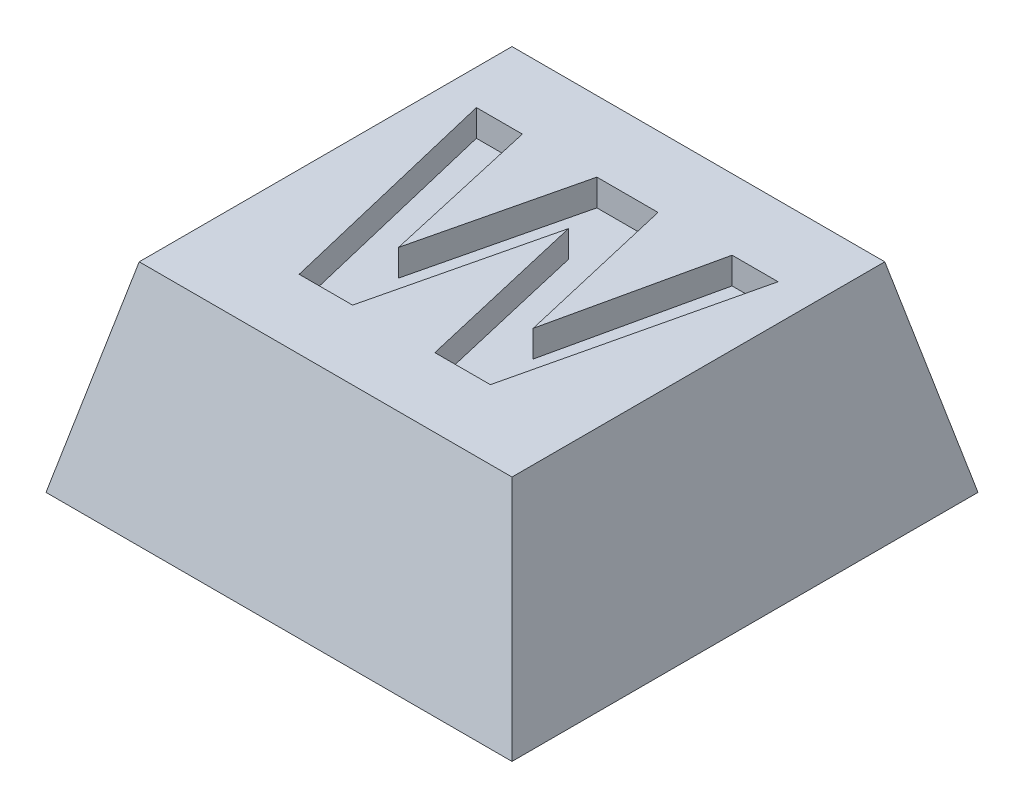
ISO-10303-21;
HEADER;
FILE_DESCRIPTION(('STEP AP214'),'2;1');
FILE_NAME('part.step','',(''),(''),'','','');
FILE_SCHEMA(('AUTOMOTIVE_DESIGN { 1 0 10303 214 1 1 1 1 }'));
ENDSEC;
DATA;
#1=APPLICATION_CONTEXT('core data for automotive mechanical design processes');
#2=APPLICATION_PROTOCOL_DEFINITION('international standard','automotive_design',2000,#1);
#3=PRODUCT_CONTEXT('',#1,'mechanical');
#4=PRODUCT('Part','Part','',(#3));
#5=PRODUCT_RELATED_PRODUCT_CATEGORY('part','',(#4));
#6=PRODUCT_DEFINITION_FORMATION('','',#4);
#7=PRODUCT_DEFINITION_CONTEXT('part definition',#1,'design');
#8=PRODUCT_DEFINITION('design','',#6,#7);
#9=PRODUCT_DEFINITION_SHAPE('','',#8);
#10=(LENGTH_UNIT() NAMED_UNIT(*) SI_UNIT(.MILLI.,.METRE.));
#11=(NAMED_UNIT(*) PLANE_ANGLE_UNIT() SI_UNIT($,.RADIAN.));
#12=(NAMED_UNIT(*) SI_UNIT($,.STERADIAN.) SOLID_ANGLE_UNIT());
#13=UNCERTAINTY_MEASURE_WITH_UNIT(LENGTH_MEASURE(1.E-05),#10,'distance_accuracy_value','');
#14=(GEOMETRIC_REPRESENTATION_CONTEXT(3) GLOBAL_UNCERTAINTY_ASSIGNED_CONTEXT((#13)) GLOBAL_UNIT_ASSIGNED_CONTEXT((#10,
#11,#12)) REPRESENTATION_CONTEXT('',''));
#15=CARTESIAN_POINT('',(0.,0.,0.));
#16=DIRECTION('',(0.,0.,1.));
#17=DIRECTION('',(1.,0.,0.));
#18=AXIS2_PLACEMENT_3D('',#15,#16,#17);
#19=CARTESIAN_POINT('',(0.,3.,0.));
#20=DIRECTION('',(0.,-1.,0.));
#21=DIRECTION('',(0.,0.,-1.));
#22=AXIS2_PLACEMENT_3D('',#19,#20,#21);
#23=PLANE('',#22);
#24=DIRECTION('',(-1.,0.,0.));
#25=VECTOR('',#24,1.);
#26=CARTESIAN_POINT('',(11.,3.,-0.7));
#27=LINE('',#26,#25);
#28=CARTESIAN_POINT('',(6.3,3.,-0.7));
#29=VERTEX_POINT('',#28);
#30=CARTESIAN_POINT('',(0.7,3.,-0.7));
#31=VERTEX_POINT('',#30);
#32=EDGE_CURVE('E66',#29,#31,#27,.T.);
#33=ORIENTED_EDGE('',*,*,#32,.F.);
#34=DIRECTION('',(0.,0.,1.));
#35=VECTOR('',#34,1.);
#36=CARTESIAN_POINT('',(6.3,3.,-7.));
#37=LINE('',#36,#35);
#38=CARTESIAN_POINT('',(6.3,3.,-6.3));
#39=VERTEX_POINT('',#38);
#40=EDGE_CURVE('E213',#39,#29,#37,.T.);
#41=ORIENTED_EDGE('',*,*,#40,.F.);
#42=DIRECTION('',(-1.,0.,0.));
#43=VECTOR('',#42,1.);
#44=CARTESIAN_POINT('',(11.,3.,-6.3));
#45=LINE('',#44,#43);
#46=CARTESIAN_POINT('',(0.699999999999998,3.,-6.3));
#47=VERTEX_POINT('',#46);
#48=EDGE_CURVE('E200',#39,#47,#45,.T.);
#49=ORIENTED_EDGE('',*,*,#48,.T.);
#50=DIRECTION('',(0.,0.,1.));
#51=VECTOR('',#50,1.);
#52=CARTESIAN_POINT('',(0.7,3.,-7.));
#53=LINE('',#52,#51);
#54=EDGE_CURVE('E214',#47,#31,#53,.T.);
#55=ORIENTED_EDGE('',*,*,#54,.T.);
#56=EDGE_LOOP('',(#33,#41,#49,#55));
#57=FACE_BOUND('',#56,.T.);
#58=DIRECTION('',(-1.,0.,0.));
#59=VECTOR('',#58,1.);
#60=CARTESIAN_POINT('',(2.86619578702468,3.,-1.73904144867035));
#61=LINE('',#60,#59);
#62=CARTESIAN_POINT('',(2.86619578702468,3.,-1.73904144867035));
#63=VERTEX_POINT('',#62);
#64=CARTESIAN_POINT('',(2.06411245369135,3.,-1.73904144867035));
#65=VERTEX_POINT('',#64);
#66=EDGE_CURVE('E59',#63,#65,#61,.T.);
#67=ORIENTED_EDGE('',*,*,#66,.T.);
#68=DIRECTION('',(-0.232805557977594,0.,-0.972523301610168));
#69=VECTOR('',#68,1.);
#70=CARTESIAN_POINT('',(2.06411245369135,3.,-1.73904144867035));
#71=LINE('',#70,#69);
#72=CARTESIAN_POINT('',(1.22627190881955,3.,-5.23904144867035));
#73=VERTEX_POINT('',#72);
#74=EDGE_CURVE('E184',#65,#73,#71,.T.);
#75=ORIENTED_EDGE('',*,*,#74,.T.);
#76=DIRECTION('',(1.,0.,0.));
#77=VECTOR('',#76,1.);
#78=CARTESIAN_POINT('',(1.22627190881955,3.,-5.23904144867035));
#79=LINE('',#78,#77);
#80=CARTESIAN_POINT('',(1.9161757549734,3.,-5.23904144867035));
#81=VERTEX_POINT('',#80);
#82=EDGE_CURVE('E554',#73,#81,#79,.T.);
#83=ORIENTED_EDGE('',*,*,#82,.T.);
#84=DIRECTION('',(0.220723550534742,0.,0.975336410803646));
#85=VECTOR('',#84,1.);
#86=CARTESIAN_POINT('',(1.9161757549734,3.,-5.23904144867035));
#87=LINE('',#86,#85);
#88=CARTESIAN_POINT('',(2.46024626779391,3.,-2.83489481405496));
#89=VERTEX_POINT('',#88);
#90=EDGE_CURVE('E556',#81,#89,#87,.T.);
#91=ORIENTED_EDGE('',*,*,#90,.T.);
#92=DIRECTION('',(0.232847309499335,0.,-0.972513306057517));
#93=VECTOR('',#92,1.);
#94=CARTESIAN_POINT('',(2.46024626779391,3.,-2.83489481405496));
#95=LINE('',#94,#93);
#96=CARTESIAN_POINT('',(3.03586726138365,3.,-5.23904144867035));
#97=VERTEX_POINT('',#96);
#98=EDGE_CURVE('E561',#89,#97,#95,.T.);
#99=ORIENTED_EDGE('',*,*,#98,.T.);
#100=DIRECTION('',(1.,0.,0.));
#101=VECTOR('',#100,1.);
#102=CARTESIAN_POINT('',(3.03586726138365,3.,-5.23904144867035));
#103=LINE('',#102,#101);
#104=CARTESIAN_POINT('',(3.95433681266571,3.,-5.23904144867035));
#105=VERTEX_POINT('',#104);
#106=EDGE_CURVE('E571',#97,#105,#103,.T.);
#107=ORIENTED_EDGE('',*,*,#106,.T.);
#108=DIRECTION('',(0.227061862326247,0.,0.973880336939265));
#109=VECTOR('',#108,1.);
#110=CARTESIAN_POINT('',(3.95433681266571,3.,-5.23904144867035));
#111=LINE('',#110,#109);
#112=CARTESIAN_POINT('',(4.52434883189647,3.,-2.7942297499524));
#113=VERTEX_POINT('',#112);
#114=EDGE_CURVE('E575',#105,#113,#111,.T.);
#115=ORIENTED_EDGE('',*,*,#114,.T.);
#116=DIRECTION('',(0.21669330416257,0.,-0.976239730768579));
#117=VECTOR('',#116,1.);
#118=CARTESIAN_POINT('',(4.52434883189647,3.,-2.7942297499524));
#119=LINE('',#118,#117);
#120=CARTESIAN_POINT('',(5.06701710112724,3.,-5.23904144867035));
#121=VERTEX_POINT('',#120);
#122=EDGE_CURVE('E579',#113,#121,#119,.T.);
#123=ORIENTED_EDGE('',*,*,#122,.T.);
#124=DIRECTION('',(1.,0.,0.));
#125=VECTOR('',#124,1.);
#126=CARTESIAN_POINT('',(5.06701710112724,3.,-5.23904144867035));
#127=LINE('',#126,#125);
#128=CARTESIAN_POINT('',(5.75832319087083,3.,-5.23904144867035));
#129=VERTEX_POINT('',#128);
#130=EDGE_CURVE('E583',#121,#129,#127,.T.);
#131=ORIENTED_EDGE('',*,*,#130,.T.);
#132=DIRECTION('',(-0.228745850379276,0.,0.973486176550167));
#133=VECTOR('',#132,1.);
#134=CARTESIAN_POINT('',(5.75832319087083,3.,-5.23904144867035));
#135=LINE('',#134,#133);
#136=CARTESIAN_POINT('',(4.93590732548622,3.,-1.73904144867035));
#137=VERTEX_POINT('',#136);
#138=EDGE_CURVE('E517',#129,#137,#135,.T.);
#139=ORIENTED_EDGE('',*,*,#138,.T.);
#140=DIRECTION('',(-1.,0.,0.));
#141=VECTOR('',#140,1.);
#142=CARTESIAN_POINT('',(4.93590732548622,3.,-1.73904144867035));
#143=LINE('',#142,#141);
#144=CARTESIAN_POINT('',(4.10227351138365,3.,-1.73904144867035));
#145=VERTEX_POINT('',#144);
#146=EDGE_CURVE('E512',#137,#145,#143,.T.);
#147=ORIENTED_EDGE('',*,*,#146,.T.);
#148=DIRECTION('',(-0.227031625408111,0.,-0.973887386233414));
#149=VECTOR('',#148,1.);
#150=CARTESIAN_POINT('',(4.10227351138365,3.,-1.73904144867035));
#151=LINE('',#150,#149);
#152=CARTESIAN_POINT('',(3.49229754984519,3.,-4.35562798713188));
#153=VERTEX_POINT('',#152);
#154=EDGE_CURVE('E506',#145,#153,#151,.T.);
#155=ORIENTED_EDGE('',*,*,#154,.T.);
#156=DIRECTION('',(-0.232712537268101,0.,0.972545564484381));
#157=VECTOR('',#156,1.);
#158=CARTESIAN_POINT('',(3.49229754984519,3.,-4.35562798713188));
#159=LINE('',#158,#157);
#160=EDGE_CURVE('E180',#153,#63,#159,.T.);
#161=ORIENTED_EDGE('',*,*,#160,.T.);
#162=EDGE_LOOP('',(#67,#75,#83,#91,#99,#107,#115,#123,#131,#139,#147,#155,#161));
#163=FACE_BOUND('',#162,.T.);
#164=ADVANCED_FACE('F43',(#57,#163),#23,.F.);
#165=CARTESIAN_POINT('',(7.,0.,-7.));
#166=DIRECTION('',(-0.973841209741793,-0.227229615606418,0.));
#167=DIRECTION('',(0.227229615606418,-0.973841209741793,0.));
#168=AXIS2_PLACEMENT_3D('',#165,#166,#167);
#169=PLANE('',#168);
#170=DIRECTION('',(-0.221581128241521,0.949633406749377,-0.221581128241521));
#171=VECTOR('',#170,1.);
#172=CARTESIAN_POINT('',(6.6563126252505,1.47294589178357,-0.343687374749499));
#173=LINE('',#172,#171);
#174=CARTESIAN_POINT('',(7.,0.,0.));
#175=VERTEX_POINT('',#174);
#176=EDGE_CURVE('E210',#175,#29,#173,.T.);
#177=ORIENTED_EDGE('',*,*,#176,.F.);
#178=DIRECTION('',(0.,0.,-1.));
#179=VECTOR('',#178,1.);
#180=CARTESIAN_POINT('',(7.,0.,0.));
#181=LINE('',#180,#179);
#182=CARTESIAN_POINT('',(7.,0.,-7.));
#183=VERTEX_POINT('',#182);
#184=EDGE_CURVE('E228',#175,#183,#181,.T.);
#185=ORIENTED_EDGE('',*,*,#184,.T.);
#186=DIRECTION('',(0.221581128241521,-0.949633406749377,-0.221581128241521));
#187=VECTOR('',#186,1.);
#188=CARTESIAN_POINT('',(7.,0.,-7.));
#189=LINE('',#188,#187);
#190=EDGE_CURVE('E204',#39,#183,#189,.T.);
#191=ORIENTED_EDGE('',*,*,#190,.F.);
#192=ORIENTED_EDGE('',*,*,#40,.T.);
#193=EDGE_LOOP('',(#177,#185,#191,#192));
#194=FACE_BOUND('',#193,.T.);
#195=ADVANCED_FACE('F253',(#194),#169,.F.);
#196=CARTESIAN_POINT('',(0.,0.,-7.));
#197=DIRECTION('',(0.973841209741793,-0.227229615606418,0.));
#198=DIRECTION('',(0.227229615606418,0.973841209741793,0.));
#199=AXIS2_PLACEMENT_3D('',#196,#197,#198);
#200=PLANE('',#199);
#201=DIRECTION('',(-0.221581128241521,-0.949633406749378,0.221581128241521));
#202=VECTOR('',#201,1.);
#203=CARTESIAN_POINT('',(0.343687374749499,1.47294589178357,-0.3436873747495));
#204=LINE('',#203,#202);
#205=CARTESIAN_POINT('',(0.,0.,0.));
#206=VERTEX_POINT('',#205);
#207=EDGE_CURVE('E11',#31,#206,#204,.T.);
#208=ORIENTED_EDGE('',*,*,#207,.F.);
#209=ORIENTED_EDGE('',*,*,#54,.F.);
#210=DIRECTION('',(0.221581128241521,0.949633406749377,0.221581128241521));
#211=VECTOR('',#210,1.);
#212=CARTESIAN_POINT('',(0.,0.,-7.));
#213=LINE('',#212,#211);
#214=CARTESIAN_POINT('',(0.,0.,-7.));
#215=VERTEX_POINT('',#214);
#216=EDGE_CURVE('E52',#215,#47,#213,.T.);
#217=ORIENTED_EDGE('',*,*,#216,.F.);
#218=DIRECTION('',(0.,0.,1.));
#219=VECTOR('',#218,1.);
#220=CARTESIAN_POINT('',(0.,0.,0.));
#221=LINE('',#220,#219);
#222=EDGE_CURVE('E218',#215,#206,#221,.T.);
#223=ORIENTED_EDGE('',*,*,#222,.T.);
#224=EDGE_LOOP('',(#208,#209,#217,#223));
#225=FACE_BOUND('',#224,.T.);
#226=ADVANCED_FACE('F246',(#225),#200,.F.);
#227=CARTESIAN_POINT('',(0.,0.,0.));
#228=DIRECTION('',(0.,-1.,0.));
#229=DIRECTION('',(0.,0.,-1.));
#230=AXIS2_PLACEMENT_3D('',#227,#228,#229);
#231=PLANE('',#230);
#232=CARTESIAN_POINT('',(3.5,0.,-3.5));
#233=DIRECTION('',(0.,-1.,0.));
#234=DIRECTION('',(0.,0.,-1.));
#235=AXIS2_PLACEMENT_3D('',#232,#233,#234);
#236=CIRCLE('',#235,1.8);
#237=CARTESIAN_POINT('',(3.5,0.,-5.3));
#238=VERTEX_POINT('',#237);
#239=EDGE_CURVE('E186',#238,#238,#236,.T.);
#240=ORIENTED_EDGE('',*,*,#239,.F.);
#241=EDGE_LOOP('',(#240));
#242=FACE_BOUND('',#241,.T.);
#243=ORIENTED_EDGE('',*,*,#222,.F.);
#244=DIRECTION('',(-1.,0.,0.));
#245=VECTOR('',#244,1.);
#246=CARTESIAN_POINT('',(0.,0.,-7.));
#247=LINE('',#246,#245);
#248=EDGE_CURVE('E232',#183,#215,#247,.T.);
#249=ORIENTED_EDGE('',*,*,#248,.F.);
#250=ORIENTED_EDGE('',*,*,#184,.F.);
#251=DIRECTION('',(1.,0.,0.));
#252=VECTOR('',#251,1.);
#253=CARTESIAN_POINT('',(0.,0.,0.));
#254=LINE('',#253,#252);
#255=EDGE_CURVE('E225',#206,#175,#254,.T.);
#256=ORIENTED_EDGE('',*,*,#255,.F.);
#257=EDGE_LOOP('',(#243,#249,#250,#256));
#258=FACE_BOUND('',#257,.T.);
#259=ADVANCED_FACE('F45',(#242,#258),#231,.T.);
#260=CARTESIAN_POINT('',(11.,3.,-6.3));
#261=DIRECTION('',(0.,0.227229615606418,-0.973841209741793));
#262=DIRECTION('',(0.,0.973841209741793,0.227229615606418));
#263=AXIS2_PLACEMENT_3D('',#260,#261,#262);
#264=PLANE('',#263);
#265=ORIENTED_EDGE('',*,*,#190,.T.);
#266=ORIENTED_EDGE('',*,*,#248,.T.);
#267=ORIENTED_EDGE('',*,*,#216,.T.);
#268=ORIENTED_EDGE('',*,*,#48,.F.);
#269=EDGE_LOOP('',(#265,#266,#267,#268));
#270=FACE_BOUND('',#269,.T.);
#271=ADVANCED_FACE('F237',(#270),#264,.T.);
#272=CARTESIAN_POINT('',(11.,0.,0.));
#273=DIRECTION('',(0.,0.227229615606418,0.973841209741793));
#274=DIRECTION('',(0.,-0.973841209741793,0.227229615606418));
#275=AXIS2_PLACEMENT_3D('',#272,#273,#274);
#276=PLANE('',#275);
#277=ORIENTED_EDGE('',*,*,#176,.T.);
#278=ORIENTED_EDGE('',*,*,#32,.T.);
#279=ORIENTED_EDGE('',*,*,#207,.T.);
#280=ORIENTED_EDGE('',*,*,#255,.T.);
#281=EDGE_LOOP('',(#277,#278,#279,#280));
#282=FACE_BOUND('',#281,.T.);
#283=ADVANCED_FACE('F248',(#282),#276,.T.);
#284=CARTESIAN_POINT('',(3.5,0.8,-3.5));
#285=DIRECTION('',(0.,-1.,0.));
#286=DIRECTION('',(0.,0.,-1.));
#287=AXIS2_PLACEMENT_3D('',#284,#285,#286);
#288=CYLINDRICAL_SURFACE('',#287,1.8);
#289=CARTESIAN_POINT('',(3.5,0.8,-3.5));
#290=DIRECTION('',(0.,-1.,0.));
#291=DIRECTION('',(0.,0.,-1.));
#292=AXIS2_PLACEMENT_3D('',#289,#290,#291);
#293=CIRCLE('',#292,1.8);
#294=CARTESIAN_POINT('',(3.5,0.8,-5.3));
#295=VERTEX_POINT('',#294);
#296=EDGE_CURVE('E192',#295,#295,#293,.T.);
#297=ORIENTED_EDGE('',*,*,#296,.F.);
#298=EDGE_LOOP('',(#297));
#299=FACE_BOUND('',#298,.T.);
#300=ORIENTED_EDGE('',*,*,#239,.T.);
#301=EDGE_LOOP('',(#300));
#302=FACE_BOUND('',#301,.T.);
#303=ADVANCED_FACE('F271',(#299,#302),#288,.F.);
#304=CARTESIAN_POINT('',(3.5,0.8,-3.5));
#305=DIRECTION('',(0.,-1.,0.));
#306=DIRECTION('',(0.,0.,-1.));
#307=AXIS2_PLACEMENT_3D('',#304,#305,#306);
#308=PLANE('',#307);
#309=ORIENTED_EDGE('',*,*,#296,.T.);
#310=EDGE_LOOP('',(#309));
#311=FACE_BOUND('',#310,.T.);
#312=ADVANCED_FACE('F274',(#311),#308,.T.);
#313=CARTESIAN_POINT('',(2.86619578702468,2.6,-1.73904144867035));
#314=DIRECTION('',(0.,0.,-1.));
#315=DIRECTION('',(-1.,0.,0.));
#316=AXIS2_PLACEMENT_3D('',#313,#314,#315);
#317=PLANE('',#316);
#318=ORIENTED_EDGE('',*,*,#66,.F.);
#319=DIRECTION('',(0.,1.,0.));
#320=VECTOR('',#319,1.);
#321=CARTESIAN_POINT('',(2.86619578702468,2.6,-1.73904144867035));
#322=LINE('',#321,#320);
#323=CARTESIAN_POINT('',(2.86619578702468,2.6,-1.73904144867035));
#324=VERTEX_POINT('',#323);
#325=EDGE_CURVE('E178',#324,#63,#322,.T.);
#326=ORIENTED_EDGE('',*,*,#325,.F.);
#327=DIRECTION('',(-1.,0.,0.));
#328=VECTOR('',#327,1.);
#329=CARTESIAN_POINT('',(2.86619578702468,2.6,-1.73904144867035));
#330=LINE('',#329,#328);
#331=CARTESIAN_POINT('',(2.06411245369135,2.6,-1.73904144867035));
#332=VERTEX_POINT('',#331);
#333=EDGE_CURVE('E168',#324,#332,#330,.T.);
#334=ORIENTED_EDGE('',*,*,#333,.T.);
#335=DIRECTION('',(0.,1.,0.));
#336=VECTOR('',#335,1.);
#337=CARTESIAN_POINT('',(2.06411245369135,2.6,-1.73904144867035));
#338=LINE('',#337,#336);
#339=EDGE_CURVE('E177',#332,#65,#338,.T.);
#340=ORIENTED_EDGE('',*,*,#339,.T.);
#341=EDGE_LOOP('',(#318,#326,#334,#340));
#342=FACE_BOUND('',#341,.T.);
#343=ADVANCED_FACE('F176',(#342),#317,.T.);
#344=CARTESIAN_POINT('',(2.06411245369135,2.6,-1.73904144867035));
#345=DIRECTION('',(0.972523301610168,0.,-0.232805557977594));
#346=DIRECTION('',(-0.232805557977594,0.,-0.972523301610168));
#347=AXIS2_PLACEMENT_3D('',#344,#345,#346);
#348=PLANE('',#347);
#349=ORIENTED_EDGE('',*,*,#74,.F.);
#350=ORIENTED_EDGE('',*,*,#339,.F.);
#351=DIRECTION('',(-0.232805557977594,0.,-0.972523301610168));
#352=VECTOR('',#351,1.);
#353=CARTESIAN_POINT('',(2.06411245369135,2.6,-1.73904144867035));
#354=LINE('',#353,#352);
#355=CARTESIAN_POINT('',(1.22627190881955,2.6,-5.23904144867035));
#356=VERTEX_POINT('',#355);
#357=EDGE_CURVE('E164',#332,#356,#354,.T.);
#358=ORIENTED_EDGE('',*,*,#357,.T.);
#359=DIRECTION('',(0.,1.,0.));
#360=VECTOR('',#359,1.);
#361=CARTESIAN_POINT('',(1.22627190881955,2.6,-5.23904144867035));
#362=LINE('',#361,#360);
#363=EDGE_CURVE('E187',#356,#73,#362,.T.);
#364=ORIENTED_EDGE('',*,*,#363,.T.);
#365=EDGE_LOOP('',(#349,#350,#358,#364));
#366=FACE_BOUND('',#365,.T.);
#367=ADVANCED_FACE('F182',(#366),#348,.T.);
#368=CARTESIAN_POINT('',(1.22627190881955,2.6,-5.23904144867035));
#369=DIRECTION('',(0.,0.,1.));
#370=DIRECTION('',(1.,0.,0.));
#371=AXIS2_PLACEMENT_3D('',#368,#369,#370);
#372=PLANE('',#371);
#373=ORIENTED_EDGE('',*,*,#82,.F.);
#374=ORIENTED_EDGE('',*,*,#363,.F.);
#375=DIRECTION('',(1.,0.,0.));
#376=VECTOR('',#375,1.);
#377=CARTESIAN_POINT('',(1.22627190881955,2.6,-5.23904144867035));
#378=LINE('',#377,#376);
#379=CARTESIAN_POINT('',(1.9161757549734,2.6,-5.23904144867035));
#380=VERTEX_POINT('',#379);
#381=EDGE_CURVE('E170',#356,#380,#378,.T.);
#382=ORIENTED_EDGE('',*,*,#381,.T.);
#383=DIRECTION('',(0.,1.,0.));
#384=VECTOR('',#383,1.);
#385=CARTESIAN_POINT('',(1.9161757549734,2.6,-5.23904144867035));
#386=LINE('',#385,#384);
#387=EDGE_CURVE('E194',#380,#81,#386,.T.);
#388=ORIENTED_EDGE('',*,*,#387,.T.);
#389=EDGE_LOOP('',(#373,#374,#382,#388));
#390=FACE_BOUND('',#389,.T.);
#391=ADVANCED_FACE('F283',(#390),#372,.T.);
#392=CARTESIAN_POINT('',(1.9161757549734,2.6,-5.23904144867035));
#393=DIRECTION('',(-0.975336410803646,0.,0.220723550534742));
#394=DIRECTION('',(0.220723550534742,0.,0.975336410803646));
#395=AXIS2_PLACEMENT_3D('',#392,#393,#394);
#396=PLANE('',#395);
#397=ORIENTED_EDGE('',*,*,#90,.F.);
#398=ORIENTED_EDGE('',*,*,#387,.F.);
#399=DIRECTION('',(0.220723550534742,0.,0.975336410803646));
#400=VECTOR('',#399,1.);
#401=CARTESIAN_POINT('',(1.9161757549734,2.6,-5.23904144867035));
#402=LINE('',#401,#400);
#403=CARTESIAN_POINT('',(2.46024626779391,2.6,-2.83489481405496));
#404=VERTEX_POINT('',#403);
#405=EDGE_CURVE('E622',#380,#404,#402,.T.);
#406=ORIENTED_EDGE('',*,*,#405,.T.);
#407=DIRECTION('',(0.,1.,0.));
#408=VECTOR('',#407,1.);
#409=CARTESIAN_POINT('',(2.46024626779391,2.6,-2.83489481405496));
#410=LINE('',#409,#408);
#411=EDGE_CURVE('E547',#404,#89,#410,.T.);
#412=ORIENTED_EDGE('',*,*,#411,.T.);
#413=EDGE_LOOP('',(#397,#398,#406,#412));
#414=FACE_BOUND('',#413,.T.);
#415=ADVANCED_FACE('F286',(#414),#396,.T.);
#416=CARTESIAN_POINT('',(2.46024626779391,2.6,-2.83489481405496));
#417=DIRECTION('',(0.972513306057516,0.,0.232847309499335));
#418=DIRECTION('',(0.232847309499335,0.,-0.972513306057517));
#419=AXIS2_PLACEMENT_3D('',#416,#417,#418);
#420=PLANE('',#419);
#421=ORIENTED_EDGE('',*,*,#98,.F.);
#422=ORIENTED_EDGE('',*,*,#411,.F.);
#423=DIRECTION('',(0.232847309499335,0.,-0.972513306057517));
#424=VECTOR('',#423,1.);
#425=CARTESIAN_POINT('',(2.46024626779391,2.6,-2.83489481405496));
#426=LINE('',#425,#424);
#427=CARTESIAN_POINT('',(3.03586726138365,2.6,-5.23904144867035));
#428=VERTEX_POINT('',#427);
#429=EDGE_CURVE('E619',#404,#428,#426,.T.);
#430=ORIENTED_EDGE('',*,*,#429,.T.);
#431=DIRECTION('',(0.,1.,0.));
#432=VECTOR('',#431,1.);
#433=CARTESIAN_POINT('',(3.03586726138365,2.6,-5.23904144867035));
#434=LINE('',#433,#432);
#435=EDGE_CURVE('E544',#428,#97,#434,.T.);
#436=ORIENTED_EDGE('',*,*,#435,.T.);
#437=EDGE_LOOP('',(#421,#422,#430,#436));
#438=FACE_BOUND('',#437,.T.);
#439=ADVANCED_FACE('F290',(#438),#420,.T.);
#440=CARTESIAN_POINT('',(3.03586726138365,2.6,-5.23904144867035));
#441=DIRECTION('',(0.,0.,1.));
#442=DIRECTION('',(1.,0.,0.));
#443=AXIS2_PLACEMENT_3D('',#440,#441,#442);
#444=PLANE('',#443);
#445=ORIENTED_EDGE('',*,*,#106,.F.);
#446=ORIENTED_EDGE('',*,*,#435,.F.);
#447=DIRECTION('',(1.,0.,0.));
#448=VECTOR('',#447,1.);
#449=CARTESIAN_POINT('',(3.03586726138365,2.6,-5.23904144867035));
#450=LINE('',#449,#448);
#451=CARTESIAN_POINT('',(3.95433681266571,2.6,-5.23904144867035));
#452=VERTEX_POINT('',#451);
#453=EDGE_CURVE('E616',#428,#452,#450,.T.);
#454=ORIENTED_EDGE('',*,*,#453,.T.);
#455=DIRECTION('',(0.,1.,0.));
#456=VECTOR('',#455,1.);
#457=CARTESIAN_POINT('',(3.95433681266571,2.6,-5.23904144867035));
#458=LINE('',#457,#456);
#459=EDGE_CURVE('E541',#452,#105,#458,.T.);
#460=ORIENTED_EDGE('',*,*,#459,.T.);
#461=EDGE_LOOP('',(#445,#446,#454,#460));
#462=FACE_BOUND('',#461,.T.);
#463=ADVANCED_FACE('F294',(#462),#444,.T.);
#464=CARTESIAN_POINT('',(3.95433681266571,2.6,-5.23904144867035));
#465=DIRECTION('',(-0.973880336939265,0.,0.227061862326247));
#466=DIRECTION('',(0.227061862326247,0.,0.973880336939265));
#467=AXIS2_PLACEMENT_3D('',#464,#465,#466);
#468=PLANE('',#467);
#469=ORIENTED_EDGE('',*,*,#114,.F.);
#470=ORIENTED_EDGE('',*,*,#459,.F.);
#471=DIRECTION('',(0.227061862326247,0.,0.973880336939265));
#472=VECTOR('',#471,1.);
#473=CARTESIAN_POINT('',(3.95433681266571,2.6,-5.23904144867035));
#474=LINE('',#473,#472);
#475=CARTESIAN_POINT('',(4.52434883189647,2.6,-2.7942297499524));
#476=VERTEX_POINT('',#475);
#477=EDGE_CURVE('E613',#452,#476,#474,.T.);
#478=ORIENTED_EDGE('',*,*,#477,.T.);
#479=DIRECTION('',(0.,1.,0.));
#480=VECTOR('',#479,1.);
#481=CARTESIAN_POINT('',(4.52434883189647,2.6,-2.7942297499524));
#482=LINE('',#481,#480);
#483=EDGE_CURVE('E538',#476,#113,#482,.T.);
#484=ORIENTED_EDGE('',*,*,#483,.T.);
#485=EDGE_LOOP('',(#469,#470,#478,#484));
#486=FACE_BOUND('',#485,.T.);
#487=ADVANCED_FACE('F298',(#486),#468,.T.);
#488=CARTESIAN_POINT('',(4.52434883189647,2.6,-2.7942297499524));
#489=DIRECTION('',(0.976239730768579,0.,0.21669330416257));
#490=DIRECTION('',(0.21669330416257,0.,-0.976239730768579));
#491=AXIS2_PLACEMENT_3D('',#488,#489,#490);
#492=PLANE('',#491);
#493=ORIENTED_EDGE('',*,*,#122,.F.);
#494=ORIENTED_EDGE('',*,*,#483,.F.);
#495=DIRECTION('',(0.21669330416257,0.,-0.976239730768579));
#496=VECTOR('',#495,1.);
#497=CARTESIAN_POINT('',(4.52434883189647,2.6,-2.7942297499524));
#498=LINE('',#497,#496);
#499=CARTESIAN_POINT('',(5.06701710112724,2.6,-5.23904144867035));
#500=VERTEX_POINT('',#499);
#501=EDGE_CURVE('E610',#476,#500,#498,.T.);
#502=ORIENTED_EDGE('',*,*,#501,.T.);
#503=DIRECTION('',(0.,1.,0.));
#504=VECTOR('',#503,1.);
#505=CARTESIAN_POINT('',(5.06701710112724,2.6,-5.23904144867035));
#506=LINE('',#505,#504);
#507=EDGE_CURVE('E535',#500,#121,#506,.T.);
#508=ORIENTED_EDGE('',*,*,#507,.T.);
#509=EDGE_LOOP('',(#493,#494,#502,#508));
#510=FACE_BOUND('',#509,.T.);
#511=ADVANCED_FACE('F302',(#510),#492,.T.);
#512=CARTESIAN_POINT('',(5.06701710112724,2.6,-5.23904144867035));
#513=DIRECTION('',(0.,0.,1.));
#514=DIRECTION('',(1.,0.,0.));
#515=AXIS2_PLACEMENT_3D('',#512,#513,#514);
#516=PLANE('',#515);
#517=ORIENTED_EDGE('',*,*,#130,.F.);
#518=ORIENTED_EDGE('',*,*,#507,.F.);
#519=DIRECTION('',(1.,0.,0.));
#520=VECTOR('',#519,1.);
#521=CARTESIAN_POINT('',(5.06701710112724,2.6,-5.23904144867035));
#522=LINE('',#521,#520);
#523=CARTESIAN_POINT('',(5.75832319087083,2.6,-5.23904144867035));
#524=VERTEX_POINT('',#523);
#525=EDGE_CURVE('E607',#500,#524,#522,.T.);
#526=ORIENTED_EDGE('',*,*,#525,.T.);
#527=DIRECTION('',(0.,1.,0.));
#528=VECTOR('',#527,1.);
#529=CARTESIAN_POINT('',(5.75832319087083,2.6,-5.23904144867035));
#530=LINE('',#529,#528);
#531=EDGE_CURVE('E532',#524,#129,#530,.T.);
#532=ORIENTED_EDGE('',*,*,#531,.T.);
#533=EDGE_LOOP('',(#517,#518,#526,#532));
#534=FACE_BOUND('',#533,.T.);
#535=ADVANCED_FACE('F306',(#534),#516,.T.);
#536=CARTESIAN_POINT('',(5.75832319087083,2.6,-5.23904144867035));
#537=DIRECTION('',(-0.973486176550167,0.,-0.228745850379276));
#538=DIRECTION('',(-0.228745850379276,0.,0.973486176550167));
#539=AXIS2_PLACEMENT_3D('',#536,#537,#538);
#540=PLANE('',#539);
#541=ORIENTED_EDGE('',*,*,#138,.F.);
#542=ORIENTED_EDGE('',*,*,#531,.F.);
#543=DIRECTION('',(-0.228745850379276,0.,0.973486176550167));
#544=VECTOR('',#543,1.);
#545=CARTESIAN_POINT('',(5.75832319087083,2.6,-5.23904144867035));
#546=LINE('',#545,#544);
#547=CARTESIAN_POINT('',(4.93590732548622,2.6,-1.73904144867035));
#548=VERTEX_POINT('',#547);
#549=EDGE_CURVE('E592',#524,#548,#546,.T.);
#550=ORIENTED_EDGE('',*,*,#549,.T.);
#551=DIRECTION('',(0.,1.,0.));
#552=VECTOR('',#551,1.);
#553=CARTESIAN_POINT('',(4.93590732548622,2.6,-1.73904144867035));
#554=LINE('',#553,#552);
#555=EDGE_CURVE('E529',#548,#137,#554,.T.);
#556=ORIENTED_EDGE('',*,*,#555,.T.);
#557=EDGE_LOOP('',(#541,#542,#550,#556));
#558=FACE_BOUND('',#557,.T.);
#559=ADVANCED_FACE('F310',(#558),#540,.T.);
#560=CARTESIAN_POINT('',(4.93590732548622,2.6,-1.73904144867035));
#561=DIRECTION('',(0.,0.,-1.));
#562=DIRECTION('',(-1.,0.,0.));
#563=AXIS2_PLACEMENT_3D('',#560,#561,#562);
#564=PLANE('',#563);
#565=ORIENTED_EDGE('',*,*,#146,.F.);
#566=ORIENTED_EDGE('',*,*,#555,.F.);
#567=DIRECTION('',(-1.,0.,0.));
#568=VECTOR('',#567,1.);
#569=CARTESIAN_POINT('',(4.93590732548622,2.6,-1.73904144867035));
#570=LINE('',#569,#568);
#571=CARTESIAN_POINT('',(4.10227351138365,2.6,-1.73904144867035));
#572=VERTEX_POINT('',#571);
#573=EDGE_CURVE('E594',#548,#572,#570,.T.);
#574=ORIENTED_EDGE('',*,*,#573,.T.);
#575=DIRECTION('',(0.,1.,0.));
#576=VECTOR('',#575,1.);
#577=CARTESIAN_POINT('',(4.10227351138365,2.6,-1.73904144867035));
#578=LINE('',#577,#576);
#579=EDGE_CURVE('E526',#572,#145,#578,.T.);
#580=ORIENTED_EDGE('',*,*,#579,.T.);
#581=EDGE_LOOP('',(#565,#566,#574,#580));
#582=FACE_BOUND('',#581,.T.);
#583=ADVANCED_FACE('F314',(#582),#564,.T.);
#584=CARTESIAN_POINT('',(4.10227351138365,2.6,-1.73904144867035));
#585=DIRECTION('',(0.973887386233414,0.,-0.227031625408111));
#586=DIRECTION('',(-0.227031625408111,0.,-0.973887386233414));
#587=AXIS2_PLACEMENT_3D('',#584,#585,#586);
#588=PLANE('',#587);
#589=ORIENTED_EDGE('',*,*,#154,.F.);
#590=ORIENTED_EDGE('',*,*,#579,.F.);
#591=DIRECTION('',(-0.227031625408111,0.,-0.973887386233414));
#592=VECTOR('',#591,1.);
#593=CARTESIAN_POINT('',(4.10227351138365,2.6,-1.73904144867035));
#594=LINE('',#593,#592);
#595=CARTESIAN_POINT('',(3.49229754984519,2.6,-4.35562798713188));
#596=VERTEX_POINT('',#595);
#597=EDGE_CURVE('E596',#572,#596,#594,.T.);
#598=ORIENTED_EDGE('',*,*,#597,.T.);
#599=DIRECTION('',(0.,1.,0.));
#600=VECTOR('',#599,1.);
#601=CARTESIAN_POINT('',(3.49229754984519,2.6,-4.35562798713188));
#602=LINE('',#601,#600);
#603=EDGE_CURVE('E504',#596,#153,#602,.T.);
#604=ORIENTED_EDGE('',*,*,#603,.T.);
#605=EDGE_LOOP('',(#589,#590,#598,#604));
#606=FACE_BOUND('',#605,.T.);
#607=ADVANCED_FACE('F318',(#606),#588,.T.);
#608=CARTESIAN_POINT('',(3.49229754984519,2.6,-4.35562798713188));
#609=DIRECTION('',(-0.972545564484381,0.,-0.232712537268101));
#610=DIRECTION('',(-0.232712537268101,0.,0.972545564484381));
#611=AXIS2_PLACEMENT_3D('',#608,#609,#610);
#612=PLANE('',#611);
#613=ORIENTED_EDGE('',*,*,#160,.F.);
#614=ORIENTED_EDGE('',*,*,#603,.F.);
#615=DIRECTION('',(-0.232712537268101,0.,0.972545564484381));
#616=VECTOR('',#615,1.);
#617=CARTESIAN_POINT('',(3.49229754984519,2.6,-4.35562798713188));
#618=LINE('',#617,#616);
#619=EDGE_CURVE('E523',#596,#324,#618,.T.);
#620=ORIENTED_EDGE('',*,*,#619,.T.);
#621=ORIENTED_EDGE('',*,*,#325,.T.);
#622=EDGE_LOOP('',(#613,#614,#620,#621));
#623=FACE_BOUND('',#622,.T.);
#624=ADVANCED_FACE('F322',(#623),#612,.T.);
#625=CARTESIAN_POINT('',(0.,2.6,0.));
#626=DIRECTION('',(0.,-1.,0.));
#627=DIRECTION('',(0.,0.,-1.));
#628=AXIS2_PLACEMENT_3D('',#625,#626,#627);
#629=PLANE('',#628);
#630=ORIENTED_EDGE('',*,*,#333,.F.);
#631=ORIENTED_EDGE('',*,*,#619,.F.);
#632=ORIENTED_EDGE('',*,*,#597,.F.);
#633=ORIENTED_EDGE('',*,*,#573,.F.);
#634=ORIENTED_EDGE('',*,*,#549,.F.);
#635=ORIENTED_EDGE('',*,*,#525,.F.);
#636=ORIENTED_EDGE('',*,*,#501,.F.);
#637=ORIENTED_EDGE('',*,*,#477,.F.);
#638=ORIENTED_EDGE('',*,*,#453,.F.);
#639=ORIENTED_EDGE('',*,*,#429,.F.);
#640=ORIENTED_EDGE('',*,*,#405,.F.);
#641=ORIENTED_EDGE('',*,*,#381,.F.);
#642=ORIENTED_EDGE('',*,*,#357,.F.);
#643=EDGE_LOOP('',(#630,#631,#632,#633,#634,#635,#636,#637,#638,#639,#640,#641,#642));
#644=FACE_BOUND('',#643,.T.);
#645=ADVANCED_FACE('F166',(#644),#629,.F.);
#646=CLOSED_SHELL('',(#164,#195,#226,#259,#271,#283,#303,#312,#343,#367,#391,#415,#439,#463,
#487,#511,#535,#559,#583,#607,#624,#645));
#647=MANIFOLD_SOLID_BREP('B2',#646);
#648=ADVANCED_BREP_SHAPE_REPRESENTATION('',(#18,#647),#14);
#649=SHAPE_DEFINITION_REPRESENTATION(#9,#648);
ENDSEC;
END-ISO-10303-21;
